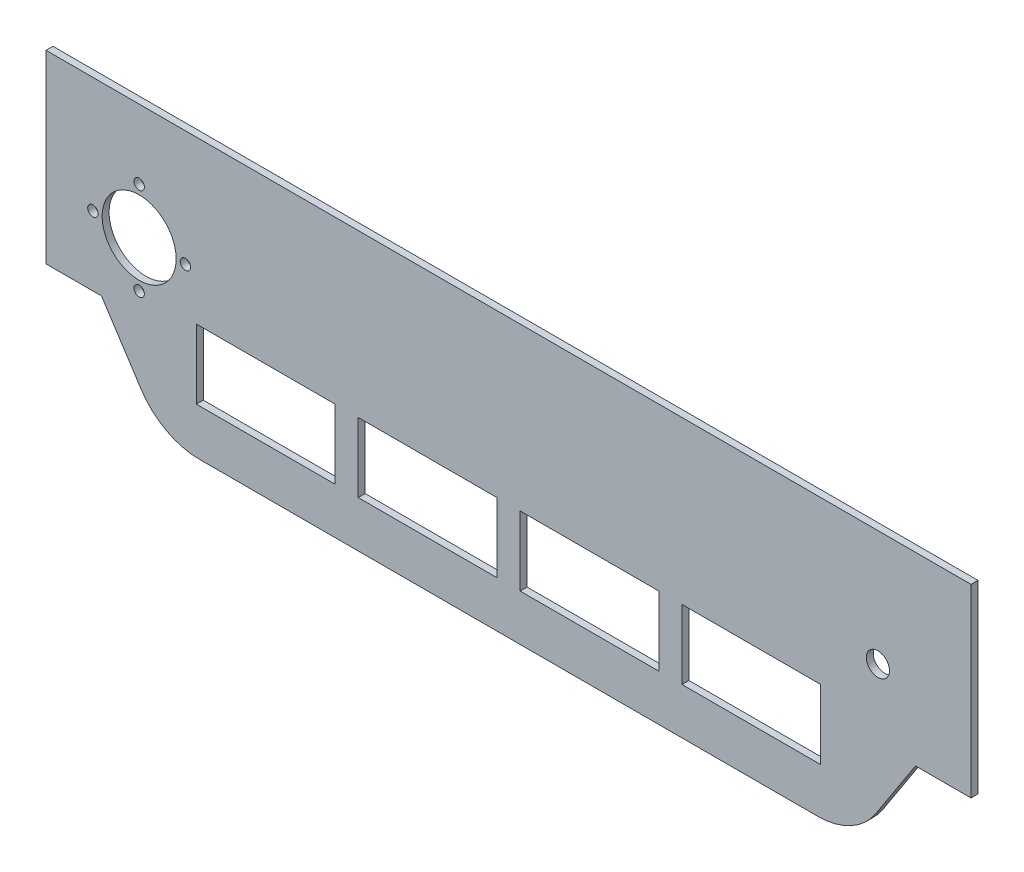
ISO-10303-21;
HEADER;
FILE_DESCRIPTION(('STEP AP214'),'2;1');
FILE_NAME('part.step','',(''),(''),'','','');
FILE_SCHEMA(('AUTOMOTIVE_DESIGN { 1 0 10303 214 1 1 1 1 }'));
ENDSEC;
DATA;
#1=APPLICATION_CONTEXT('core data for automotive mechanical design processes');
#2=APPLICATION_PROTOCOL_DEFINITION('international standard','automotive_design',2000,#1);
#3=PRODUCT_CONTEXT('',#1,'mechanical');
#4=PRODUCT('Part','Part','',(#3));
#5=PRODUCT_RELATED_PRODUCT_CATEGORY('part','',(#4));
#6=PRODUCT_DEFINITION_FORMATION('','',#4);
#7=PRODUCT_DEFINITION_CONTEXT('part definition',#1,'design');
#8=PRODUCT_DEFINITION('design','',#6,#7);
#9=PRODUCT_DEFINITION_SHAPE('','',#8);
#10=(LENGTH_UNIT() NAMED_UNIT(*) SI_UNIT(.MILLI.,.METRE.));
#11=(NAMED_UNIT(*) PLANE_ANGLE_UNIT() SI_UNIT($,.RADIAN.));
#12=(NAMED_UNIT(*) SI_UNIT($,.STERADIAN.) SOLID_ANGLE_UNIT());
#13=UNCERTAINTY_MEASURE_WITH_UNIT(LENGTH_MEASURE(1.E-05),#10,'distance_accuracy_value','');
#14=(GEOMETRIC_REPRESENTATION_CONTEXT(3) GLOBAL_UNCERTAINTY_ASSIGNED_CONTEXT((#13)) GLOBAL_UNIT_ASSIGNED_CONTEXT((#10,
#11,#12)) REPRESENTATION_CONTEXT('',''));
#15=CARTESIAN_POINT('',(0.,0.,0.));
#16=DIRECTION('',(0.,0.,1.));
#17=DIRECTION('',(1.,0.,0.));
#18=AXIS2_PLACEMENT_3D('',#15,#16,#17);
#19=CARTESIAN_POINT('',(399.872727163389,53.6503494821376,3.));
#20=DIRECTION('',(-0.838443616300637,0.544988350595414,0.));
#21=DIRECTION('',(-0.544988350595414,-0.838443616300637,0.));
#22=AXIS2_PLACEMENT_3D('',#19,#20,#21);
#23=PLANE('',#22);
#24=DIRECTION('',(0.,0.,1.));
#25=VECTOR('',#24,1.);
#26=CARTESIAN_POINT('',(391.,40.,0.));
#27=LINE('',#26,#25);
#28=CARTESIAN_POINT('',(391.,40.,0.));
#29=VERTEX_POINT('',#28);
#30=CARTESIAN_POINT('',(391.,40.,3.));
#31=VERTEX_POINT('',#30);
#32=EDGE_CURVE('E46',#29,#31,#27,.T.);
#33=ORIENTED_EDGE('',*,*,#32,.T.);
#34=DIRECTION('',(0.544988350595414,0.838443616300637,0.));
#35=VECTOR('',#34,1.);
#36=CARTESIAN_POINT('',(399.872727163389,53.6503494821376,3.));
#37=LINE('',#36,#35);
#38=CARTESIAN_POINT('',(373.872727163389,13.6503494821376,3.));
#39=VERTEX_POINT('',#38);
#40=EDGE_CURVE('E429',#39,#31,#37,.T.);
#41=ORIENTED_EDGE('',*,*,#40,.F.);
#42=DIRECTION('',(0.,0.,-1.));
#43=VECTOR('',#42,1.);
#44=CARTESIAN_POINT('',(373.872727163389,13.6503494821376,3.));
#45=LINE('',#44,#43);
#46=CARTESIAN_POINT('',(373.872727163389,13.6503494821376,0.));
#47=VERTEX_POINT('',#46);
#48=EDGE_CURVE('E431',#39,#47,#45,.T.);
#49=ORIENTED_EDGE('',*,*,#48,.T.);
#50=DIRECTION('',(0.544988350595414,0.838443616300637,0.));
#51=VECTOR('',#50,1.);
#52=CARTESIAN_POINT('',(399.872727163389,53.6503494821376,0.));
#53=LINE('',#52,#51);
#54=EDGE_CURVE('E423',#47,#29,#53,.T.);
#55=ORIENTED_EDGE('',*,*,#54,.T.);
#56=EDGE_LOOP('',(#33,#41,#49,#55));
#57=FACE_BOUND('',#56,.T.);
#58=ADVANCED_FACE('F31',(#57),#23,.F.);
#59=CARTESIAN_POINT('',(56.1272728366106,13.6503494821376,3.));
#60=DIRECTION('',(0.838443616300637,0.544988350595414,0.));
#61=DIRECTION('',(-0.544988350595414,0.838443616300637,0.));
#62=AXIS2_PLACEMENT_3D('',#59,#60,#61);
#63=PLANE('',#62);
#64=DIRECTION('',(0.544988350595414,-0.838443616300637,0.));
#65=VECTOR('',#64,1.);
#66=CARTESIAN_POINT('',(56.1272728366106,13.6503494821376,3.));
#67=LINE('',#66,#65);
#68=CARTESIAN_POINT('',(39.,40.,3.));
#69=VERTEX_POINT('',#68);
#70=CARTESIAN_POINT('',(56.1272728366106,13.6503494821376,3.));
#71=VERTEX_POINT('',#70);
#72=EDGE_CURVE('E54',#69,#71,#67,.T.);
#73=ORIENTED_EDGE('',*,*,#72,.F.);
#74=DIRECTION('',(0.,0.,1.));
#75=VECTOR('',#74,1.);
#76=CARTESIAN_POINT('',(38.9999999999999,40.0000000000001,0.));
#77=LINE('',#76,#75);
#78=CARTESIAN_POINT('',(38.9999999999999,40.0000000000001,0.));
#79=VERTEX_POINT('',#78);
#80=EDGE_CURVE('E249',#79,#69,#77,.T.);
#81=ORIENTED_EDGE('',*,*,#80,.F.);
#82=DIRECTION('',(0.544988350595414,-0.838443616300637,0.));
#83=VECTOR('',#82,1.);
#84=CARTESIAN_POINT('',(56.1272728366106,13.6503494821376,0.));
#85=LINE('',#84,#83);
#86=CARTESIAN_POINT('',(56.1272728366106,13.6503494821376,0.));
#87=VERTEX_POINT('',#86);
#88=EDGE_CURVE('E414',#79,#87,#85,.T.);
#89=ORIENTED_EDGE('',*,*,#88,.T.);
#90=DIRECTION('',(0.,0.,-1.));
#91=VECTOR('',#90,1.);
#92=CARTESIAN_POINT('',(56.1272728366106,13.6503494821376,3.));
#93=LINE('',#92,#91);
#94=EDGE_CURVE('E11',#71,#87,#93,.T.);
#95=ORIENTED_EDGE('',*,*,#94,.F.);
#96=EDGE_LOOP('',(#73,#81,#89,#95));
#97=FACE_BOUND('',#96,.T.);
#98=ADVANCED_FACE('F33',(#97),#63,.F.);
#99=CARTESIAN_POINT('',(81.2805813256297,30.,3.));
#100=DIRECTION('',(0.,0.,-1.));
#101=DIRECTION('',(-1.,0.,0.));
#102=AXIS2_PLACEMENT_3D('',#99,#100,#101);
#103=CYLINDRICAL_SURFACE('',#102,30.);
#104=CARTESIAN_POINT('',(81.2805813256297,30.,0.));
#105=DIRECTION('',(0.,0.,1.));
#106=DIRECTION('',(-1.,0.,0.));
#107=AXIS2_PLACEMENT_3D('',#104,#105,#106);
#108=CIRCLE('',#107,30.);
#109=CARTESIAN_POINT('',(81.2805813256297,0.,0.));
#110=VERTEX_POINT('',#109);
#111=EDGE_CURVE('E433',#87,#110,#108,.T.);
#112=ORIENTED_EDGE('',*,*,#111,.T.);
#113=DIRECTION('',(0.,0.,-1.));
#114=VECTOR('',#113,1.);
#115=CARTESIAN_POINT('',(81.2805813256297,0.,3.));
#116=LINE('',#115,#114);
#117=CARTESIAN_POINT('',(81.2805813256297,0.,3.));
#118=VERTEX_POINT('',#117);
#119=EDGE_CURVE('E39',#118,#110,#116,.T.);
#120=ORIENTED_EDGE('',*,*,#119,.F.);
#121=CARTESIAN_POINT('',(81.2805813256297,30.,3.));
#122=DIRECTION('',(0.,0.,1.));
#123=DIRECTION('',(-1.,0.,0.));
#124=AXIS2_PLACEMENT_3D('',#121,#122,#123);
#125=CIRCLE('',#124,30.);
#126=EDGE_CURVE('E422',#71,#118,#125,.T.);
#127=ORIENTED_EDGE('',*,*,#126,.F.);
#128=ORIENTED_EDGE('',*,*,#94,.T.);
#129=EDGE_LOOP('',(#112,#120,#127,#128));
#130=FACE_BOUND('',#129,.T.);
#131=ADVANCED_FACE('F461',(#130),#103,.T.);
#132=CARTESIAN_POINT('',(348.71941867437,0.,3.));
#133=DIRECTION('',(0.,1.,0.));
#134=DIRECTION('',(0.,0.,1.));
#135=AXIS2_PLACEMENT_3D('',#132,#133,#134);
#136=PLANE('',#135);
#137=DIRECTION('',(1.,0.,0.));
#138=VECTOR('',#137,1.);
#139=CARTESIAN_POINT('',(348.71941867437,0.,0.));
#140=LINE('',#139,#138);
#141=CARTESIAN_POINT('',(348.71941867437,0.,0.));
#142=VERTEX_POINT('',#141);
#143=EDGE_CURVE('E435',#110,#142,#140,.T.);
#144=ORIENTED_EDGE('',*,*,#143,.T.);
#145=DIRECTION('',(0.,0.,-1.));
#146=VECTOR('',#145,1.);
#147=CARTESIAN_POINT('',(348.71941867437,0.,3.));
#148=LINE('',#147,#146);
#149=CARTESIAN_POINT('',(348.71941867437,0.,3.));
#150=VERTEX_POINT('',#149);
#151=EDGE_CURVE('E442',#150,#142,#148,.T.);
#152=ORIENTED_EDGE('',*,*,#151,.F.);
#153=DIRECTION('',(1.,0.,0.));
#154=VECTOR('',#153,1.);
#155=CARTESIAN_POINT('',(348.71941867437,0.,3.));
#156=LINE('',#155,#154);
#157=EDGE_CURVE('E425',#118,#150,#156,.T.);
#158=ORIENTED_EDGE('',*,*,#157,.F.);
#159=ORIENTED_EDGE('',*,*,#119,.T.);
#160=EDGE_LOOP('',(#144,#152,#158,#159));
#161=FACE_BOUND('',#160,.T.);
#162=ADVANCED_FACE('F449',(#161),#136,.F.);
#163=CARTESIAN_POINT('',(348.71941867437,30.,3.));
#164=DIRECTION('',(0.,0.,-1.));
#165=DIRECTION('',(-1.,0.,0.));
#166=AXIS2_PLACEMENT_3D('',#163,#164,#165);
#167=CYLINDRICAL_SURFACE('',#166,30.);
#168=CARTESIAN_POINT('',(348.71941867437,30.,0.));
#169=DIRECTION('',(0.,0.,1.));
#170=DIRECTION('',(-1.,0.,0.));
#171=AXIS2_PLACEMENT_3D('',#168,#169,#170);
#172=CIRCLE('',#171,30.);
#173=EDGE_CURVE('E437',#142,#47,#172,.T.);
#174=ORIENTED_EDGE('',*,*,#173,.T.);
#175=ORIENTED_EDGE('',*,*,#48,.F.);
#176=CARTESIAN_POINT('',(348.71941867437,30.,3.));
#177=DIRECTION('',(0.,0.,1.));
#178=DIRECTION('',(-1.,0.,0.));
#179=AXIS2_PLACEMENT_3D('',#176,#177,#178);
#180=CIRCLE('',#179,30.);
#181=EDGE_CURVE('E427',#150,#39,#180,.T.);
#182=ORIENTED_EDGE('',*,*,#181,.F.);
#183=ORIENTED_EDGE('',*,*,#151,.T.);
#184=EDGE_LOOP('',(#174,#175,#182,#183));
#185=FACE_BOUND('',#184,.T.);
#186=ADVANCED_FACE('F457',(#185),#167,.T.);
#187=CARTESIAN_POINT('',(55.2805813256297,70.,3.));
#188=DIRECTION('',(0.,0.,1.));
#189=DIRECTION('',(1.,0.,0.));
#190=AXIS2_PLACEMENT_3D('',#187,#188,#189);
#191=PLANE('',#190);
#192=CARTESIAN_POINT('',(374.71941867437,70.,3.));
#193=DIRECTION('',(0.,0.,1.));
#194=DIRECTION('',(1.,0.,0.));
#195=AXIS2_PLACEMENT_3D('',#192,#193,#194);
#196=CIRCLE('',#195,4.99999999999999);
#197=CARTESIAN_POINT('',(379.71941867437,70.,3.));
#198=VERTEX_POINT('',#197);
#199=EDGE_CURVE('E248',#198,#198,#196,.T.);
#200=ORIENTED_EDGE('',*,*,#199,.F.);
#201=EDGE_LOOP('',(#200));
#202=FACE_BOUND('',#201,.T.);
#203=CARTESIAN_POINT('',(35.2805813256297,70.,3.));
#204=DIRECTION('',(0.,0.,1.));
#205=DIRECTION('',(1.,0.,0.));
#206=AXIS2_PLACEMENT_3D('',#203,#204,#205);
#207=CIRCLE('',#206,2.25);
#208=CARTESIAN_POINT('',(37.5305813256297,70.,3.));
#209=VERTEX_POINT('',#208);
#210=EDGE_CURVE('E260',#209,#209,#207,.T.);
#211=ORIENTED_EDGE('',*,*,#210,.F.);
#212=EDGE_LOOP('',(#211));
#213=FACE_BOUND('',#212,.T.);
#214=CARTESIAN_POINT('',(55.2805813256297,50.,3.));
#215=DIRECTION('',(0.,0.,1.));
#216=DIRECTION('',(1.,0.,0.));
#217=AXIS2_PLACEMENT_3D('',#214,#215,#216);
#218=CIRCLE('',#217,2.25);
#219=CARTESIAN_POINT('',(57.5305813256297,50.,3.));
#220=VERTEX_POINT('',#219);
#221=EDGE_CURVE('E266',#220,#220,#218,.T.);
#222=ORIENTED_EDGE('',*,*,#221,.F.);
#223=EDGE_LOOP('',(#222));
#224=FACE_BOUND('',#223,.T.);
#225=CARTESIAN_POINT('',(75.2805813256297,70.,3.));
#226=DIRECTION('',(0.,0.,1.));
#227=DIRECTION('',(1.,0.,0.));
#228=AXIS2_PLACEMENT_3D('',#225,#226,#227);
#229=CIRCLE('',#228,2.25);
#230=CARTESIAN_POINT('',(77.5305813256297,70.,3.));
#231=VERTEX_POINT('',#230);
#232=EDGE_CURVE('E272',#231,#231,#229,.T.);
#233=ORIENTED_EDGE('',*,*,#232,.F.);
#234=EDGE_LOOP('',(#233));
#235=FACE_BOUND('',#234,.T.);
#236=CARTESIAN_POINT('',(55.2805813256297,90.,3.));
#237=DIRECTION('',(0.,0.,1.));
#238=DIRECTION('',(1.,0.,0.));
#239=AXIS2_PLACEMENT_3D('',#236,#237,#238);
#240=CIRCLE('',#239,2.25);
#241=CARTESIAN_POINT('',(57.5305813256297,90.,3.));
#242=VERTEX_POINT('',#241);
#243=EDGE_CURVE('E278',#242,#242,#240,.T.);
#244=ORIENTED_EDGE('',*,*,#243,.F.);
#245=EDGE_LOOP('',(#244));
#246=FACE_BOUND('',#245,.T.);
#247=CARTESIAN_POINT('',(55.2805813256297,70.,3.));
#248=DIRECTION('',(0.,0.,1.));
#249=DIRECTION('',(1.,0.,0.));
#250=AXIS2_PLACEMENT_3D('',#247,#248,#249);
#251=CIRCLE('',#250,16.);
#252=CARTESIAN_POINT('',(71.2805813256297,70.,3.));
#253=VERTEX_POINT('',#252);
#254=EDGE_CURVE('E284',#253,#253,#251,.T.);
#255=ORIENTED_EDGE('',*,*,#254,.F.);
#256=EDGE_LOOP('',(#255));
#257=FACE_BOUND('',#256,.T.);
#258=DIRECTION('',(0.,-1.,0.));
#259=VECTOR('',#258,1.);
#260=CARTESIAN_POINT('',(290.,20.,3.));
#261=LINE('',#260,#259);
#262=CARTESIAN_POINT('',(290.,50.,3.));
#263=VERTEX_POINT('',#262);
#264=CARTESIAN_POINT('',(290.,20.,3.));
#265=VERTEX_POINT('',#264);
#266=EDGE_CURVE('E290',#263,#265,#261,.T.);
#267=ORIENTED_EDGE('',*,*,#266,.F.);
#268=DIRECTION('',(-1.,0.,0.));
#269=VECTOR('',#268,1.);
#270=CARTESIAN_POINT('',(350.,50.,3.));
#271=LINE('',#270,#269);
#272=CARTESIAN_POINT('',(350.,50.,3.));
#273=VERTEX_POINT('',#272);
#274=EDGE_CURVE('E297',#273,#263,#271,.T.);
#275=ORIENTED_EDGE('',*,*,#274,.F.);
#276=DIRECTION('',(0.,1.,0.));
#277=VECTOR('',#276,1.);
#278=CARTESIAN_POINT('',(350.,20.,3.));
#279=LINE('',#278,#277);
#280=CARTESIAN_POINT('',(350.,20.,3.));
#281=VERTEX_POINT('',#280);
#282=EDGE_CURVE('E311',#281,#273,#279,.T.);
#283=ORIENTED_EDGE('',*,*,#282,.F.);
#284=DIRECTION('',(1.,0.,0.));
#285=VECTOR('',#284,1.);
#286=CARTESIAN_POINT('',(350.,20.,3.));
#287=LINE('',#286,#285);
#288=EDGE_CURVE('E308',#265,#281,#287,.T.);
#289=ORIENTED_EDGE('',*,*,#288,.F.);
#290=EDGE_LOOP('',(#267,#275,#283,#289));
#291=FACE_BOUND('',#290,.T.);
#292=DIRECTION('',(0.,1.,0.));
#293=VECTOR('',#292,1.);
#294=CARTESIAN_POINT('',(280.,50.,3.));
#295=LINE('',#294,#293);
#296=CARTESIAN_POINT('',(280.,20.,3.));
#297=VERTEX_POINT('',#296);
#298=CARTESIAN_POINT('',(280.,50.,3.));
#299=VERTEX_POINT('',#298);
#300=EDGE_CURVE('E318',#297,#299,#295,.T.);
#301=ORIENTED_EDGE('',*,*,#300,.F.);
#302=DIRECTION('',(1.,0.,0.));
#303=VECTOR('',#302,1.);
#304=CARTESIAN_POINT('',(220.,20.,3.));
#305=LINE('',#304,#303);
#306=CARTESIAN_POINT('',(220.,20.,3.));
#307=VERTEX_POINT('',#306);
#308=EDGE_CURVE('E329',#307,#297,#305,.T.);
#309=ORIENTED_EDGE('',*,*,#308,.F.);
#310=DIRECTION('',(0.,-1.,0.));
#311=VECTOR('',#310,1.);
#312=CARTESIAN_POINT('',(220.,50.,3.));
#313=LINE('',#312,#311);
#314=CARTESIAN_POINT('',(220.,50.,3.));
#315=VERTEX_POINT('',#314);
#316=EDGE_CURVE('E343',#315,#307,#313,.T.);
#317=ORIENTED_EDGE('',*,*,#316,.F.);
#318=DIRECTION('',(-1.,0.,0.));
#319=VECTOR('',#318,1.);
#320=CARTESIAN_POINT('',(220.,50.,3.));
#321=LINE('',#320,#319);
#322=EDGE_CURVE('E340',#299,#315,#321,.T.);
#323=ORIENTED_EDGE('',*,*,#322,.F.);
#324=EDGE_LOOP('',(#301,#309,#317,#323));
#325=FACE_BOUND('',#324,.T.);
#326=DIRECTION('',(0.,1.,0.));
#327=VECTOR('',#326,1.);
#328=CARTESIAN_POINT('',(210.,50.,3.));
#329=LINE('',#328,#327);
#330=CARTESIAN_POINT('',(210.,20.,3.));
#331=VERTEX_POINT('',#330);
#332=CARTESIAN_POINT('',(210.,50.,3.));
#333=VERTEX_POINT('',#332);
#334=EDGE_CURVE('E350',#331,#333,#329,.T.);
#335=ORIENTED_EDGE('',*,*,#334,.F.);
#336=DIRECTION('',(1.,0.,0.));
#337=VECTOR('',#336,1.);
#338=CARTESIAN_POINT('',(150.,20.,3.));
#339=LINE('',#338,#337);
#340=CARTESIAN_POINT('',(150.,20.,3.));
#341=VERTEX_POINT('',#340);
#342=EDGE_CURVE('E361',#341,#331,#339,.T.);
#343=ORIENTED_EDGE('',*,*,#342,.F.);
#344=DIRECTION('',(0.,-1.,0.));
#345=VECTOR('',#344,1.);
#346=CARTESIAN_POINT('',(150.,50.,3.));
#347=LINE('',#346,#345);
#348=CARTESIAN_POINT('',(150.,50.,3.));
#349=VERTEX_POINT('',#348);
#350=EDGE_CURVE('E375',#349,#341,#347,.T.);
#351=ORIENTED_EDGE('',*,*,#350,.F.);
#352=DIRECTION('',(-1.,0.,0.));
#353=VECTOR('',#352,1.);
#354=CARTESIAN_POINT('',(150.,50.,3.));
#355=LINE('',#354,#353);
#356=EDGE_CURVE('E372',#333,#349,#355,.T.);
#357=ORIENTED_EDGE('',*,*,#356,.F.);
#358=EDGE_LOOP('',(#335,#343,#351,#357));
#359=FACE_BOUND('',#358,.T.);
#360=DIRECTION('',(0.,1.,0.));
#361=VECTOR('',#360,1.);
#362=CARTESIAN_POINT('',(140.,50.,3.));
#363=LINE('',#362,#361);
#364=CARTESIAN_POINT('',(140.,20.,3.));
#365=VERTEX_POINT('',#364);
#366=CARTESIAN_POINT('',(140.,50.,3.));
#367=VERTEX_POINT('',#366);
#368=EDGE_CURVE('E382',#365,#367,#363,.T.);
#369=ORIENTED_EDGE('',*,*,#368,.F.);
#370=DIRECTION('',(1.,0.,0.));
#371=VECTOR('',#370,1.);
#372=CARTESIAN_POINT('',(80.,20.,3.));
#373=LINE('',#372,#371);
#374=CARTESIAN_POINT('',(80.,20.,3.));
#375=VERTEX_POINT('',#374);
#376=EDGE_CURVE('E393',#375,#365,#373,.T.);
#377=ORIENTED_EDGE('',*,*,#376,.F.);
#378=DIRECTION('',(0.,-1.,0.));
#379=VECTOR('',#378,1.);
#380=CARTESIAN_POINT('',(80.,50.,3.));
#381=LINE('',#380,#379);
#382=CARTESIAN_POINT('',(80.,50.,3.));
#383=VERTEX_POINT('',#382);
#384=EDGE_CURVE('E407',#383,#375,#381,.T.);
#385=ORIENTED_EDGE('',*,*,#384,.F.);
#386=DIRECTION('',(-1.,0.,0.));
#387=VECTOR('',#386,1.);
#388=CARTESIAN_POINT('',(80.,50.,3.));
#389=LINE('',#388,#387);
#390=EDGE_CURVE('E404',#367,#383,#389,.T.);
#391=ORIENTED_EDGE('',*,*,#390,.F.);
#392=EDGE_LOOP('',(#369,#377,#385,#391));
#393=FACE_BOUND('',#392,.T.);
#394=ORIENTED_EDGE('',*,*,#40,.T.);
#395=DIRECTION('',(-1.,0.,0.));
#396=VECTOR('',#395,1.);
#397=CARTESIAN_POINT('',(215.,39.9999999999999,3.));
#398=LINE('',#397,#396);
#399=CARTESIAN_POINT('',(415.,39.9999999999999,3.));
#400=VERTEX_POINT('',#399);
#401=EDGE_CURVE('E241',#400,#31,#398,.T.);
#402=ORIENTED_EDGE('',*,*,#401,.F.);
#403=DIRECTION('',(0.,-1.,0.));
#404=VECTOR('',#403,1.);
#405=CARTESIAN_POINT('',(415.,-264.967528681372,3.));
#406=LINE('',#405,#404);
#407=CARTESIAN_POINT('',(415.,120.,3.));
#408=VERTEX_POINT('',#407);
#409=EDGE_CURVE('E222',#408,#400,#406,.T.);
#410=ORIENTED_EDGE('',*,*,#409,.F.);
#411=DIRECTION('',(1.,0.,0.));
#412=VECTOR('',#411,1.);
#413=CARTESIAN_POINT('',(215.,120.,3.));
#414=LINE('',#413,#412);
#415=CARTESIAN_POINT('',(15.,120.,3.));
#416=VERTEX_POINT('',#415);
#417=EDGE_CURVE('E244',#416,#408,#414,.T.);
#418=ORIENTED_EDGE('',*,*,#417,.F.);
#419=DIRECTION('',(0.,1.,0.));
#420=VECTOR('',#419,1.);
#421=CARTESIAN_POINT('',(15.0000000000001,-264.967528681372,3.));
#422=LINE('',#421,#420);
#423=CARTESIAN_POINT('',(15.,39.9999999999999,3.));
#424=VERTEX_POINT('',#423);
#425=EDGE_CURVE('E233',#424,#416,#422,.T.);
#426=ORIENTED_EDGE('',*,*,#425,.F.);
#427=DIRECTION('',(1.,0.,0.));
#428=VECTOR('',#427,1.);
#429=CARTESIAN_POINT('',(215.,40.,3.));
#430=LINE('',#429,#428);
#431=EDGE_CURVE('E230',#424,#69,#430,.T.);
#432=ORIENTED_EDGE('',*,*,#431,.T.);
#433=ORIENTED_EDGE('',*,*,#72,.T.);
#434=ORIENTED_EDGE('',*,*,#126,.T.);
#435=ORIENTED_EDGE('',*,*,#157,.T.);
#436=ORIENTED_EDGE('',*,*,#181,.T.);
#437=EDGE_LOOP('',(#394,#402,#410,#418,#426,#432,#433,#434,#435,#436));
#438=FACE_BOUND('',#437,.T.);
#439=ADVANCED_FACE('F460',(#202,#213,#224,#235,#246,#257,#291,#325,#359,#393,#438),#191,.T.);
#440=CARTESIAN_POINT('',(55.2805813256297,70.,0.));
#441=DIRECTION('',(0.,0.,1.));
#442=DIRECTION('',(1.,0.,0.));
#443=AXIS2_PLACEMENT_3D('',#440,#441,#442);
#444=PLANE('',#443);
#445=CARTESIAN_POINT('',(374.71941867437,70.,0.));
#446=DIRECTION('',(0.,0.,1.));
#447=DIRECTION('',(1.,0.,0.));
#448=AXIS2_PLACEMENT_3D('',#445,#446,#447);
#449=CIRCLE('',#448,4.99999999999999);
#450=CARTESIAN_POINT('',(379.71941867437,70.,0.));
#451=VERTEX_POINT('',#450);
#452=EDGE_CURVE('E257',#451,#451,#449,.T.);
#453=ORIENTED_EDGE('',*,*,#452,.T.);
#454=EDGE_LOOP('',(#453));
#455=FACE_BOUND('',#454,.T.);
#456=CARTESIAN_POINT('',(35.2805813256297,70.,0.));
#457=DIRECTION('',(0.,0.,1.));
#458=DIRECTION('',(1.,0.,0.));
#459=AXIS2_PLACEMENT_3D('',#456,#457,#458);
#460=CIRCLE('',#459,2.25);
#461=CARTESIAN_POINT('',(37.5305813256297,70.,0.));
#462=VERTEX_POINT('',#461);
#463=EDGE_CURVE('E263',#462,#462,#460,.T.);
#464=ORIENTED_EDGE('',*,*,#463,.T.);
#465=EDGE_LOOP('',(#464));
#466=FACE_BOUND('',#465,.T.);
#467=CARTESIAN_POINT('',(55.2805813256297,50.,0.));
#468=DIRECTION('',(0.,0.,1.));
#469=DIRECTION('',(1.,0.,0.));
#470=AXIS2_PLACEMENT_3D('',#467,#468,#469);
#471=CIRCLE('',#470,2.25);
#472=CARTESIAN_POINT('',(57.5305813256297,50.,0.));
#473=VERTEX_POINT('',#472);
#474=EDGE_CURVE('E269',#473,#473,#471,.T.);
#475=ORIENTED_EDGE('',*,*,#474,.T.);
#476=EDGE_LOOP('',(#475));
#477=FACE_BOUND('',#476,.T.);
#478=CARTESIAN_POINT('',(75.2805813256297,70.,0.));
#479=DIRECTION('',(0.,0.,1.));
#480=DIRECTION('',(1.,0.,0.));
#481=AXIS2_PLACEMENT_3D('',#478,#479,#480);
#482=CIRCLE('',#481,2.25);
#483=CARTESIAN_POINT('',(77.5305813256297,70.,0.));
#484=VERTEX_POINT('',#483);
#485=EDGE_CURVE('E275',#484,#484,#482,.T.);
#486=ORIENTED_EDGE('',*,*,#485,.T.);
#487=EDGE_LOOP('',(#486));
#488=FACE_BOUND('',#487,.T.);
#489=CARTESIAN_POINT('',(55.2805813256297,90.,0.));
#490=DIRECTION('',(0.,0.,1.));
#491=DIRECTION('',(1.,0.,0.));
#492=AXIS2_PLACEMENT_3D('',#489,#490,#491);
#493=CIRCLE('',#492,2.25);
#494=CARTESIAN_POINT('',(57.5305813256297,90.,0.));
#495=VERTEX_POINT('',#494);
#496=EDGE_CURVE('E281',#495,#495,#493,.T.);
#497=ORIENTED_EDGE('',*,*,#496,.T.);
#498=EDGE_LOOP('',(#497));
#499=FACE_BOUND('',#498,.T.);
#500=CARTESIAN_POINT('',(55.2805813256297,70.,0.));
#501=DIRECTION('',(0.,0.,1.));
#502=DIRECTION('',(1.,0.,0.));
#503=AXIS2_PLACEMENT_3D('',#500,#501,#502);
#504=CIRCLE('',#503,16.);
#505=CARTESIAN_POINT('',(71.2805813256297,70.,0.));
#506=VERTEX_POINT('',#505);
#507=EDGE_CURVE('E287',#506,#506,#504,.T.);
#508=ORIENTED_EDGE('',*,*,#507,.T.);
#509=EDGE_LOOP('',(#508));
#510=FACE_BOUND('',#509,.T.);
#511=DIRECTION('',(-1.,0.,0.));
#512=VECTOR('',#511,1.);
#513=CARTESIAN_POINT('',(350.,50.,0.));
#514=LINE('',#513,#512);
#515=CARTESIAN_POINT('',(350.,50.,0.));
#516=VERTEX_POINT('',#515);
#517=CARTESIAN_POINT('',(290.,50.,0.));
#518=VERTEX_POINT('',#517);
#519=EDGE_CURVE('E303',#516,#518,#514,.T.);
#520=ORIENTED_EDGE('',*,*,#519,.T.);
#521=DIRECTION('',(0.,-1.,0.));
#522=VECTOR('',#521,1.);
#523=CARTESIAN_POINT('',(290.,20.,0.));
#524=LINE('',#523,#522);
#525=CARTESIAN_POINT('',(290.,20.,0.));
#526=VERTEX_POINT('',#525);
#527=EDGE_CURVE('E293',#518,#526,#524,.T.);
#528=ORIENTED_EDGE('',*,*,#527,.T.);
#529=DIRECTION('',(1.,0.,0.));
#530=VECTOR('',#529,1.);
#531=CARTESIAN_POINT('',(350.,20.,0.));
#532=LINE('',#531,#530);
#533=CARTESIAN_POINT('',(350.,20.,0.));
#534=VERTEX_POINT('',#533);
#535=EDGE_CURVE('E296',#526,#534,#532,.T.);
#536=ORIENTED_EDGE('',*,*,#535,.T.);
#537=DIRECTION('',(0.,1.,0.));
#538=VECTOR('',#537,1.);
#539=CARTESIAN_POINT('',(350.,20.,0.));
#540=LINE('',#539,#538);
#541=EDGE_CURVE('E300',#534,#516,#540,.T.);
#542=ORIENTED_EDGE('',*,*,#541,.T.);
#543=EDGE_LOOP('',(#520,#528,#536,#542));
#544=FACE_BOUND('',#543,.T.);
#545=DIRECTION('',(1.,0.,0.));
#546=VECTOR('',#545,1.);
#547=CARTESIAN_POINT('',(220.,20.,0.));
#548=LINE('',#547,#546);
#549=CARTESIAN_POINT('',(220.,20.,0.));
#550=VERTEX_POINT('',#549);
#551=CARTESIAN_POINT('',(280.,20.,0.));
#552=VERTEX_POINT('',#551);
#553=EDGE_CURVE('E335',#550,#552,#548,.T.);
#554=ORIENTED_EDGE('',*,*,#553,.T.);
#555=DIRECTION('',(0.,1.,0.));
#556=VECTOR('',#555,1.);
#557=CARTESIAN_POINT('',(280.,50.,0.));
#558=LINE('',#557,#556);
#559=CARTESIAN_POINT('',(280.,50.,0.));
#560=VERTEX_POINT('',#559);
#561=EDGE_CURVE('E325',#552,#560,#558,.T.);
#562=ORIENTED_EDGE('',*,*,#561,.T.);
#563=DIRECTION('',(-1.,0.,0.));
#564=VECTOR('',#563,1.);
#565=CARTESIAN_POINT('',(220.,50.,0.));
#566=LINE('',#565,#564);
#567=CARTESIAN_POINT('',(220.,50.,0.));
#568=VERTEX_POINT('',#567);
#569=EDGE_CURVE('E328',#560,#568,#566,.T.);
#570=ORIENTED_EDGE('',*,*,#569,.T.);
#571=DIRECTION('',(0.,-1.,0.));
#572=VECTOR('',#571,1.);
#573=CARTESIAN_POINT('',(220.,50.,0.));
#574=LINE('',#573,#572);
#575=EDGE_CURVE('E332',#568,#550,#574,.T.);
#576=ORIENTED_EDGE('',*,*,#575,.T.);
#577=EDGE_LOOP('',(#554,#562,#570,#576));
#578=FACE_BOUND('',#577,.T.);
#579=DIRECTION('',(1.,0.,0.));
#580=VECTOR('',#579,1.);
#581=CARTESIAN_POINT('',(150.,20.,0.));
#582=LINE('',#581,#580);
#583=CARTESIAN_POINT('',(150.,20.,0.));
#584=VERTEX_POINT('',#583);
#585=CARTESIAN_POINT('',(210.,20.,0.));
#586=VERTEX_POINT('',#585);
#587=EDGE_CURVE('E367',#584,#586,#582,.T.);
#588=ORIENTED_EDGE('',*,*,#587,.T.);
#589=DIRECTION('',(0.,1.,0.));
#590=VECTOR('',#589,1.);
#591=CARTESIAN_POINT('',(210.,50.,0.));
#592=LINE('',#591,#590);
#593=CARTESIAN_POINT('',(210.,50.,0.));
#594=VERTEX_POINT('',#593);
#595=EDGE_CURVE('E357',#586,#594,#592,.T.);
#596=ORIENTED_EDGE('',*,*,#595,.T.);
#597=DIRECTION('',(-1.,0.,0.));
#598=VECTOR('',#597,1.);
#599=CARTESIAN_POINT('',(150.,50.,0.));
#600=LINE('',#599,#598);
#601=CARTESIAN_POINT('',(150.,50.,0.));
#602=VERTEX_POINT('',#601);
#603=EDGE_CURVE('E360',#594,#602,#600,.T.);
#604=ORIENTED_EDGE('',*,*,#603,.T.);
#605=DIRECTION('',(0.,-1.,0.));
#606=VECTOR('',#605,1.);
#607=CARTESIAN_POINT('',(150.,50.,0.));
#608=LINE('',#607,#606);
#609=EDGE_CURVE('E364',#602,#584,#608,.T.);
#610=ORIENTED_EDGE('',*,*,#609,.T.);
#611=EDGE_LOOP('',(#588,#596,#604,#610));
#612=FACE_BOUND('',#611,.T.);
#613=DIRECTION('',(1.,0.,0.));
#614=VECTOR('',#613,1.);
#615=CARTESIAN_POINT('',(80.,20.,0.));
#616=LINE('',#615,#614);
#617=CARTESIAN_POINT('',(80.,20.,0.));
#618=VERTEX_POINT('',#617);
#619=CARTESIAN_POINT('',(140.,20.,0.));
#620=VERTEX_POINT('',#619);
#621=EDGE_CURVE('E399',#618,#620,#616,.T.);
#622=ORIENTED_EDGE('',*,*,#621,.T.);
#623=DIRECTION('',(0.,1.,0.));
#624=VECTOR('',#623,1.);
#625=CARTESIAN_POINT('',(140.,50.,0.));
#626=LINE('',#625,#624);
#627=CARTESIAN_POINT('',(140.,50.,0.));
#628=VERTEX_POINT('',#627);
#629=EDGE_CURVE('E389',#620,#628,#626,.T.);
#630=ORIENTED_EDGE('',*,*,#629,.T.);
#631=DIRECTION('',(-1.,0.,0.));
#632=VECTOR('',#631,1.);
#633=CARTESIAN_POINT('',(80.,50.,0.));
#634=LINE('',#633,#632);
#635=CARTESIAN_POINT('',(80.,50.,0.));
#636=VERTEX_POINT('',#635);
#637=EDGE_CURVE('E392',#628,#636,#634,.T.);
#638=ORIENTED_EDGE('',*,*,#637,.T.);
#639=DIRECTION('',(0.,-1.,0.));
#640=VECTOR('',#639,1.);
#641=CARTESIAN_POINT('',(80.,50.,0.));
#642=LINE('',#641,#640);
#643=EDGE_CURVE('E396',#636,#618,#642,.T.);
#644=ORIENTED_EDGE('',*,*,#643,.T.);
#645=EDGE_LOOP('',(#622,#630,#638,#644));
#646=FACE_BOUND('',#645,.T.);
#647=DIRECTION('',(-1.,0.,0.));
#648=VECTOR('',#647,1.);
#649=CARTESIAN_POINT('',(215.,39.9999999999999,0.));
#650=LINE('',#649,#648);
#651=CARTESIAN_POINT('',(415.,39.9999999999999,0.));
#652=VERTEX_POINT('',#651);
#653=EDGE_CURVE('E211',#652,#29,#650,.T.);
#654=ORIENTED_EDGE('',*,*,#653,.T.);
#655=ORIENTED_EDGE('',*,*,#54,.F.);
#656=ORIENTED_EDGE('',*,*,#173,.F.);
#657=ORIENTED_EDGE('',*,*,#143,.F.);
#658=ORIENTED_EDGE('',*,*,#111,.F.);
#659=ORIENTED_EDGE('',*,*,#88,.F.);
#660=DIRECTION('',(1.,0.,0.));
#661=VECTOR('',#660,1.);
#662=CARTESIAN_POINT('',(215.,40.,0.));
#663=LINE('',#662,#661);
#664=CARTESIAN_POINT('',(15.,39.9999999999999,0.));
#665=VERTEX_POINT('',#664);
#666=EDGE_CURVE('E227',#665,#79,#663,.T.);
#667=ORIENTED_EDGE('',*,*,#666,.F.);
#668=DIRECTION('',(0.,1.,0.));
#669=VECTOR('',#668,1.);
#670=CARTESIAN_POINT('',(15.0000000000001,-264.967528681372,0.));
#671=LINE('',#670,#669);
#672=CARTESIAN_POINT('',(15.,120.,0.));
#673=VERTEX_POINT('',#672);
#674=EDGE_CURVE('E237',#665,#673,#671,.T.);
#675=ORIENTED_EDGE('',*,*,#674,.T.);
#676=DIRECTION('',(1.,0.,0.));
#677=VECTOR('',#676,1.);
#678=CARTESIAN_POINT('',(215.,120.,0.));
#679=LINE('',#678,#677);
#680=CARTESIAN_POINT('',(415.,120.,0.));
#681=VERTEX_POINT('',#680);
#682=EDGE_CURVE('E213',#673,#681,#679,.T.);
#683=ORIENTED_EDGE('',*,*,#682,.T.);
#684=DIRECTION('',(0.,-1.,0.));
#685=VECTOR('',#684,1.);
#686=CARTESIAN_POINT('',(415.,-264.967528681372,0.));
#687=LINE('',#686,#685);
#688=EDGE_CURVE('E206',#681,#652,#687,.T.);
#689=ORIENTED_EDGE('',*,*,#688,.T.);
#690=EDGE_LOOP('',(#654,#655,#656,#657,#658,#659,#667,#675,#683,#689));
#691=FACE_BOUND('',#690,.T.);
#692=ADVANCED_FACE('F208',(#455,#466,#477,#488,#499,#510,#544,#578,#612,#646,#691),#444,.F.);
#693=CARTESIAN_POINT('',(140.,50.,0.));
#694=DIRECTION('',(1.,0.,0.));
#695=DIRECTION('',(0.,0.,-1.));
#696=AXIS2_PLACEMENT_3D('',#693,#694,#695);
#697=PLANE('',#696);
#698=ORIENTED_EDGE('',*,*,#368,.T.);
#699=DIRECTION('',(0.,0.,1.));
#700=VECTOR('',#699,1.);
#701=CARTESIAN_POINT('',(140.,50.,0.));
#702=LINE('',#701,#700);
#703=EDGE_CURVE('E402',#628,#367,#702,.T.);
#704=ORIENTED_EDGE('',*,*,#703,.F.);
#705=ORIENTED_EDGE('',*,*,#629,.F.);
#706=DIRECTION('',(0.,0.,1.));
#707=VECTOR('',#706,1.);
#708=CARTESIAN_POINT('',(140.,20.,0.));
#709=LINE('',#708,#707);
#710=EDGE_CURVE('E412',#620,#365,#709,.T.);
#711=ORIENTED_EDGE('',*,*,#710,.T.);
#712=EDGE_LOOP('',(#698,#704,#705,#711));
#713=FACE_BOUND('',#712,.T.);
#714=ADVANCED_FACE('F519',(#713),#697,.F.);
#715=CARTESIAN_POINT('',(80.,20.,0.));
#716=DIRECTION('',(0.,-1.,0.));
#717=DIRECTION('',(0.,0.,-1.));
#718=AXIS2_PLACEMENT_3D('',#715,#716,#717);
#719=PLANE('',#718);
#720=ORIENTED_EDGE('',*,*,#376,.T.);
#721=ORIENTED_EDGE('',*,*,#710,.F.);
#722=ORIENTED_EDGE('',*,*,#621,.F.);
#723=DIRECTION('',(0.,0.,1.));
#724=VECTOR('',#723,1.);
#725=CARTESIAN_POINT('',(80.,20.,0.));
#726=LINE('',#725,#724);
#727=EDGE_CURVE('E415',#618,#375,#726,.T.);
#728=ORIENTED_EDGE('',*,*,#727,.T.);
#729=EDGE_LOOP('',(#720,#721,#722,#728));
#730=FACE_BOUND('',#729,.T.);
#731=ADVANCED_FACE('F526',(#730),#719,.F.);
#732=CARTESIAN_POINT('',(80.,50.,0.));
#733=DIRECTION('',(-1.,0.,0.));
#734=DIRECTION('',(0.,0.,1.));
#735=AXIS2_PLACEMENT_3D('',#732,#733,#734);
#736=PLANE('',#735);
#737=ORIENTED_EDGE('',*,*,#384,.T.);
#738=ORIENTED_EDGE('',*,*,#727,.F.);
#739=ORIENTED_EDGE('',*,*,#643,.F.);
#740=DIRECTION('',(0.,0.,1.));
#741=VECTOR('',#740,1.);
#742=CARTESIAN_POINT('',(80.,50.,0.));
#743=LINE('',#742,#741);
#744=EDGE_CURVE('E417',#636,#383,#743,.T.);
#745=ORIENTED_EDGE('',*,*,#744,.T.);
#746=EDGE_LOOP('',(#737,#738,#739,#745));
#747=FACE_BOUND('',#746,.T.);
#748=ADVANCED_FACE('F534',(#747),#736,.F.);
#749=CARTESIAN_POINT('',(80.,50.,0.));
#750=DIRECTION('',(0.,1.,0.));
#751=DIRECTION('',(0.,0.,1.));
#752=AXIS2_PLACEMENT_3D('',#749,#750,#751);
#753=PLANE('',#752);
#754=ORIENTED_EDGE('',*,*,#390,.T.);
#755=ORIENTED_EDGE('',*,*,#744,.F.);
#756=ORIENTED_EDGE('',*,*,#637,.F.);
#757=ORIENTED_EDGE('',*,*,#703,.T.);
#758=EDGE_LOOP('',(#754,#755,#756,#757));
#759=FACE_BOUND('',#758,.T.);
#760=ADVANCED_FACE('F542',(#759),#753,.F.);
#761=CARTESIAN_POINT('',(210.,50.,0.));
#762=DIRECTION('',(1.,0.,0.));
#763=DIRECTION('',(0.,0.,-1.));
#764=AXIS2_PLACEMENT_3D('',#761,#762,#763);
#765=PLANE('',#764);
#766=ORIENTED_EDGE('',*,*,#334,.T.);
#767=DIRECTION('',(0.,0.,1.));
#768=VECTOR('',#767,1.);
#769=CARTESIAN_POINT('',(210.,50.,0.));
#770=LINE('',#769,#768);
#771=EDGE_CURVE('E370',#594,#333,#770,.T.);
#772=ORIENTED_EDGE('',*,*,#771,.F.);
#773=ORIENTED_EDGE('',*,*,#595,.F.);
#774=DIRECTION('',(0.,0.,1.));
#775=VECTOR('',#774,1.);
#776=CARTESIAN_POINT('',(210.,20.,0.));
#777=LINE('',#776,#775);
#778=EDGE_CURVE('E380',#586,#331,#777,.T.);
#779=ORIENTED_EDGE('',*,*,#778,.T.);
#780=EDGE_LOOP('',(#766,#772,#773,#779));
#781=FACE_BOUND('',#780,.T.);
#782=ADVANCED_FACE('F550',(#781),#765,.F.);
#783=CARTESIAN_POINT('',(150.,20.,0.));
#784=DIRECTION('',(0.,-1.,0.));
#785=DIRECTION('',(0.,0.,-1.));
#786=AXIS2_PLACEMENT_3D('',#783,#784,#785);
#787=PLANE('',#786);
#788=ORIENTED_EDGE('',*,*,#342,.T.);
#789=ORIENTED_EDGE('',*,*,#778,.F.);
#790=ORIENTED_EDGE('',*,*,#587,.F.);
#791=DIRECTION('',(0.,0.,1.));
#792=VECTOR('',#791,1.);
#793=CARTESIAN_POINT('',(150.,20.,0.));
#794=LINE('',#793,#792);
#795=EDGE_CURVE('E383',#584,#341,#794,.T.);
#796=ORIENTED_EDGE('',*,*,#795,.T.);
#797=EDGE_LOOP('',(#788,#789,#790,#796));
#798=FACE_BOUND('',#797,.T.);
#799=ADVANCED_FACE('F558',(#798),#787,.F.);
#800=CARTESIAN_POINT('',(150.,50.,0.));
#801=DIRECTION('',(-1.,0.,0.));
#802=DIRECTION('',(0.,0.,1.));
#803=AXIS2_PLACEMENT_3D('',#800,#801,#802);
#804=PLANE('',#803);
#805=ORIENTED_EDGE('',*,*,#350,.T.);
#806=ORIENTED_EDGE('',*,*,#795,.F.);
#807=ORIENTED_EDGE('',*,*,#609,.F.);
#808=DIRECTION('',(0.,0.,1.));
#809=VECTOR('',#808,1.);
#810=CARTESIAN_POINT('',(150.,50.,0.));
#811=LINE('',#810,#809);
#812=EDGE_CURVE('E385',#602,#349,#811,.T.);
#813=ORIENTED_EDGE('',*,*,#812,.T.);
#814=EDGE_LOOP('',(#805,#806,#807,#813));
#815=FACE_BOUND('',#814,.T.);
#816=ADVANCED_FACE('F566',(#815),#804,.F.);
#817=CARTESIAN_POINT('',(150.,50.,0.));
#818=DIRECTION('',(0.,1.,0.));
#819=DIRECTION('',(0.,0.,1.));
#820=AXIS2_PLACEMENT_3D('',#817,#818,#819);
#821=PLANE('',#820);
#822=ORIENTED_EDGE('',*,*,#356,.T.);
#823=ORIENTED_EDGE('',*,*,#812,.F.);
#824=ORIENTED_EDGE('',*,*,#603,.F.);
#825=ORIENTED_EDGE('',*,*,#771,.T.);
#826=EDGE_LOOP('',(#822,#823,#824,#825));
#827=FACE_BOUND('',#826,.T.);
#828=ADVANCED_FACE('F574',(#827),#821,.F.);
#829=CARTESIAN_POINT('',(280.,50.,0.));
#830=DIRECTION('',(1.,0.,0.));
#831=DIRECTION('',(0.,0.,-1.));
#832=AXIS2_PLACEMENT_3D('',#829,#830,#831);
#833=PLANE('',#832);
#834=ORIENTED_EDGE('',*,*,#300,.T.);
#835=DIRECTION('',(0.,0.,1.));
#836=VECTOR('',#835,1.);
#837=CARTESIAN_POINT('',(280.,50.,0.));
#838=LINE('',#837,#836);
#839=EDGE_CURVE('E338',#560,#299,#838,.T.);
#840=ORIENTED_EDGE('',*,*,#839,.F.);
#841=ORIENTED_EDGE('',*,*,#561,.F.);
#842=DIRECTION('',(0.,0.,1.));
#843=VECTOR('',#842,1.);
#844=CARTESIAN_POINT('',(280.,20.,0.));
#845=LINE('',#844,#843);
#846=EDGE_CURVE('E348',#552,#297,#845,.T.);
#847=ORIENTED_EDGE('',*,*,#846,.T.);
#848=EDGE_LOOP('',(#834,#840,#841,#847));
#849=FACE_BOUND('',#848,.T.);
#850=ADVANCED_FACE('F582',(#849),#833,.F.);
#851=CARTESIAN_POINT('',(220.,20.,0.));
#852=DIRECTION('',(0.,-1.,0.));
#853=DIRECTION('',(0.,0.,-1.));
#854=AXIS2_PLACEMENT_3D('',#851,#852,#853);
#855=PLANE('',#854);
#856=ORIENTED_EDGE('',*,*,#308,.T.);
#857=ORIENTED_EDGE('',*,*,#846,.F.);
#858=ORIENTED_EDGE('',*,*,#553,.F.);
#859=DIRECTION('',(0.,0.,1.));
#860=VECTOR('',#859,1.);
#861=CARTESIAN_POINT('',(220.,20.,0.));
#862=LINE('',#861,#860);
#863=EDGE_CURVE('E351',#550,#307,#862,.T.);
#864=ORIENTED_EDGE('',*,*,#863,.T.);
#865=EDGE_LOOP('',(#856,#857,#858,#864));
#866=FACE_BOUND('',#865,.T.);
#867=ADVANCED_FACE('F590',(#866),#855,.F.);
#868=CARTESIAN_POINT('',(220.,50.,0.));
#869=DIRECTION('',(-1.,0.,0.));
#870=DIRECTION('',(0.,0.,1.));
#871=AXIS2_PLACEMENT_3D('',#868,#869,#870);
#872=PLANE('',#871);
#873=ORIENTED_EDGE('',*,*,#316,.T.);
#874=ORIENTED_EDGE('',*,*,#863,.F.);
#875=ORIENTED_EDGE('',*,*,#575,.F.);
#876=DIRECTION('',(0.,0.,1.));
#877=VECTOR('',#876,1.);
#878=CARTESIAN_POINT('',(220.,50.,0.));
#879=LINE('',#878,#877);
#880=EDGE_CURVE('E353',#568,#315,#879,.T.);
#881=ORIENTED_EDGE('',*,*,#880,.T.);
#882=EDGE_LOOP('',(#873,#874,#875,#881));
#883=FACE_BOUND('',#882,.T.);
#884=ADVANCED_FACE('F598',(#883),#872,.F.);
#885=CARTESIAN_POINT('',(220.,50.,0.));
#886=DIRECTION('',(0.,1.,0.));
#887=DIRECTION('',(0.,0.,1.));
#888=AXIS2_PLACEMENT_3D('',#885,#886,#887);
#889=PLANE('',#888);
#890=ORIENTED_EDGE('',*,*,#322,.T.);
#891=ORIENTED_EDGE('',*,*,#880,.F.);
#892=ORIENTED_EDGE('',*,*,#569,.F.);
#893=ORIENTED_EDGE('',*,*,#839,.T.);
#894=EDGE_LOOP('',(#890,#891,#892,#893));
#895=FACE_BOUND('',#894,.T.);
#896=ADVANCED_FACE('F606',(#895),#889,.F.);
#897=CARTESIAN_POINT('',(290.,20.,0.));
#898=DIRECTION('',(-1.,0.,0.));
#899=DIRECTION('',(0.,0.,1.));
#900=AXIS2_PLACEMENT_3D('',#897,#898,#899);
#901=PLANE('',#900);
#902=ORIENTED_EDGE('',*,*,#266,.T.);
#903=DIRECTION('',(0.,0.,1.));
#904=VECTOR('',#903,1.);
#905=CARTESIAN_POINT('',(290.,20.,0.));
#906=LINE('',#905,#904);
#907=EDGE_CURVE('E306',#526,#265,#906,.T.);
#908=ORIENTED_EDGE('',*,*,#907,.F.);
#909=ORIENTED_EDGE('',*,*,#527,.F.);
#910=DIRECTION('',(0.,0.,1.));
#911=VECTOR('',#910,1.);
#912=CARTESIAN_POINT('',(290.,50.,0.));
#913=LINE('',#912,#911);
#914=EDGE_CURVE('E316',#518,#263,#913,.T.);
#915=ORIENTED_EDGE('',*,*,#914,.T.);
#916=EDGE_LOOP('',(#902,#908,#909,#915));
#917=FACE_BOUND('',#916,.T.);
#918=ADVANCED_FACE('F614',(#917),#901,.F.);
#919=CARTESIAN_POINT('',(350.,50.,0.));
#920=DIRECTION('',(0.,1.,0.));
#921=DIRECTION('',(0.,0.,1.));
#922=AXIS2_PLACEMENT_3D('',#919,#920,#921);
#923=PLANE('',#922);
#924=ORIENTED_EDGE('',*,*,#274,.T.);
#925=ORIENTED_EDGE('',*,*,#914,.F.);
#926=ORIENTED_EDGE('',*,*,#519,.F.);
#927=DIRECTION('',(0.,0.,1.));
#928=VECTOR('',#927,1.);
#929=CARTESIAN_POINT('',(350.,50.,0.));
#930=LINE('',#929,#928);
#931=EDGE_CURVE('E319',#516,#273,#930,.T.);
#932=ORIENTED_EDGE('',*,*,#931,.T.);
#933=EDGE_LOOP('',(#924,#925,#926,#932));
#934=FACE_BOUND('',#933,.T.);
#935=ADVANCED_FACE('F622',(#934),#923,.F.);
#936=CARTESIAN_POINT('',(350.,20.,0.));
#937=DIRECTION('',(1.,0.,0.));
#938=DIRECTION('',(0.,0.,-1.));
#939=AXIS2_PLACEMENT_3D('',#936,#937,#938);
#940=PLANE('',#939);
#941=ORIENTED_EDGE('',*,*,#282,.T.);
#942=ORIENTED_EDGE('',*,*,#931,.F.);
#943=ORIENTED_EDGE('',*,*,#541,.F.);
#944=DIRECTION('',(0.,0.,1.));
#945=VECTOR('',#944,1.);
#946=CARTESIAN_POINT('',(350.,20.,0.));
#947=LINE('',#946,#945);
#948=EDGE_CURVE('E321',#534,#281,#947,.T.);
#949=ORIENTED_EDGE('',*,*,#948,.T.);
#950=EDGE_LOOP('',(#941,#942,#943,#949));
#951=FACE_BOUND('',#950,.T.);
#952=ADVANCED_FACE('F630',(#951),#940,.F.);
#953=CARTESIAN_POINT('',(350.,20.,0.));
#954=DIRECTION('',(0.,-1.,0.));
#955=DIRECTION('',(0.,0.,-1.));
#956=AXIS2_PLACEMENT_3D('',#953,#954,#955);
#957=PLANE('',#956);
#958=ORIENTED_EDGE('',*,*,#288,.T.);
#959=ORIENTED_EDGE('',*,*,#948,.F.);
#960=ORIENTED_EDGE('',*,*,#535,.F.);
#961=ORIENTED_EDGE('',*,*,#907,.T.);
#962=EDGE_LOOP('',(#958,#959,#960,#961));
#963=FACE_BOUND('',#962,.T.);
#964=ADVANCED_FACE('F638',(#963),#957,.F.);
#965=CARTESIAN_POINT('',(55.2805813256297,70.,0.));
#966=DIRECTION('',(0.,0.,1.));
#967=DIRECTION('',(1.,0.,0.));
#968=AXIS2_PLACEMENT_3D('',#965,#966,#967);
#969=CYLINDRICAL_SURFACE('',#968,16.);
#970=ORIENTED_EDGE('',*,*,#507,.F.);
#971=EDGE_LOOP('',(#970));
#972=FACE_BOUND('',#971,.T.);
#973=ORIENTED_EDGE('',*,*,#254,.T.);
#974=EDGE_LOOP('',(#973));
#975=FACE_BOUND('',#974,.T.);
#976=ADVANCED_FACE('F646',(#972,#975),#969,.F.);
#977=CARTESIAN_POINT('',(55.2805813256297,90.,0.));
#978=DIRECTION('',(0.,0.,1.));
#979=DIRECTION('',(1.,0.,0.));
#980=AXIS2_PLACEMENT_3D('',#977,#978,#979);
#981=CYLINDRICAL_SURFACE('',#980,2.25);
#982=ORIENTED_EDGE('',*,*,#496,.F.);
#983=EDGE_LOOP('',(#982));
#984=FACE_BOUND('',#983,.T.);
#985=ORIENTED_EDGE('',*,*,#243,.T.);
#986=EDGE_LOOP('',(#985));
#987=FACE_BOUND('',#986,.T.);
#988=ADVANCED_FACE('F654',(#984,#987),#981,.F.);
#989=CARTESIAN_POINT('',(75.2805813256297,70.,0.));
#990=DIRECTION('',(0.,0.,1.));
#991=DIRECTION('',(1.,0.,0.));
#992=AXIS2_PLACEMENT_3D('',#989,#990,#991);
#993=CYLINDRICAL_SURFACE('',#992,2.25);
#994=ORIENTED_EDGE('',*,*,#485,.F.);
#995=EDGE_LOOP('',(#994));
#996=FACE_BOUND('',#995,.T.);
#997=ORIENTED_EDGE('',*,*,#232,.T.);
#998=EDGE_LOOP('',(#997));
#999=FACE_BOUND('',#998,.T.);
#1000=ADVANCED_FACE('F662',(#996,#999),#993,.F.);
#1001=CARTESIAN_POINT('',(55.2805813256297,50.,0.));
#1002=DIRECTION('',(0.,0.,1.));
#1003=DIRECTION('',(1.,0.,0.));
#1004=AXIS2_PLACEMENT_3D('',#1001,#1002,#1003);
#1005=CYLINDRICAL_SURFACE('',#1004,2.25);
#1006=ORIENTED_EDGE('',*,*,#474,.F.);
#1007=EDGE_LOOP('',(#1006));
#1008=FACE_BOUND('',#1007,.T.);
#1009=ORIENTED_EDGE('',*,*,#221,.T.);
#1010=EDGE_LOOP('',(#1009));
#1011=FACE_BOUND('',#1010,.T.);
#1012=ADVANCED_FACE('F670',(#1008,#1011),#1005,.F.);
#1013=CARTESIAN_POINT('',(35.2805813256297,70.,0.));
#1014=DIRECTION('',(0.,0.,1.));
#1015=DIRECTION('',(1.,0.,0.));
#1016=AXIS2_PLACEMENT_3D('',#1013,#1014,#1015);
#1017=CYLINDRICAL_SURFACE('',#1016,2.25);
#1018=ORIENTED_EDGE('',*,*,#463,.F.);
#1019=EDGE_LOOP('',(#1018));
#1020=FACE_BOUND('',#1019,.T.);
#1021=ORIENTED_EDGE('',*,*,#210,.T.);
#1022=EDGE_LOOP('',(#1021));
#1023=FACE_BOUND('',#1022,.T.);
#1024=ADVANCED_FACE('F678',(#1020,#1023),#1017,.F.);
#1025=CARTESIAN_POINT('',(374.71941867437,70.,0.));
#1026=DIRECTION('',(0.,0.,1.));
#1027=DIRECTION('',(1.,0.,0.));
#1028=AXIS2_PLACEMENT_3D('',#1025,#1026,#1027);
#1029=CYLINDRICAL_SURFACE('',#1028,4.99999999999999);
#1030=ORIENTED_EDGE('',*,*,#452,.F.);
#1031=EDGE_LOOP('',(#1030));
#1032=FACE_BOUND('',#1031,.T.);
#1033=ORIENTED_EDGE('',*,*,#199,.T.);
#1034=EDGE_LOOP('',(#1033));
#1035=FACE_BOUND('',#1034,.T.);
#1036=ADVANCED_FACE('F686',(#1032,#1035),#1029,.F.);
#1037=CARTESIAN_POINT('',(215.,39.9999999999999,0.));
#1038=DIRECTION('',(0.,1.,0.));
#1039=DIRECTION('',(-1.,0.,0.));
#1040=AXIS2_PLACEMENT_3D('',#1037,#1038,#1039);
#1041=PLANE('',#1040);
#1042=ORIENTED_EDGE('',*,*,#401,.T.);
#1043=ORIENTED_EDGE('',*,*,#32,.F.);
#1044=ORIENTED_EDGE('',*,*,#653,.F.);
#1045=DIRECTION('',(0.,0.,1.));
#1046=VECTOR('',#1045,1.);
#1047=CARTESIAN_POINT('',(415.,39.9999999999999,0.));
#1048=LINE('',#1047,#1046);
#1049=EDGE_CURVE('E219',#652,#400,#1048,.T.);
#1050=ORIENTED_EDGE('',*,*,#1049,.T.);
#1051=EDGE_LOOP('',(#1042,#1043,#1044,#1050));
#1052=FACE_BOUND('',#1051,.T.);
#1053=ADVANCED_FACE('F229',(#1052),#1041,.F.);
#1054=CARTESIAN_POINT('',(215.,40.,0.));
#1055=DIRECTION('',(0.,-1.,0.));
#1056=DIRECTION('',(0.,0.,-1.));
#1057=AXIS2_PLACEMENT_3D('',#1054,#1055,#1056);
#1058=PLANE('',#1057);
#1059=ORIENTED_EDGE('',*,*,#431,.F.);
#1060=DIRECTION('',(0.,0.,1.));
#1061=VECTOR('',#1060,1.);
#1062=CARTESIAN_POINT('',(15.,39.9999999999999,0.));
#1063=LINE('',#1062,#1061);
#1064=EDGE_CURVE('E251',#665,#424,#1063,.T.);
#1065=ORIENTED_EDGE('',*,*,#1064,.F.);
#1066=ORIENTED_EDGE('',*,*,#666,.T.);
#1067=ORIENTED_EDGE('',*,*,#80,.T.);
#1068=EDGE_LOOP('',(#1059,#1065,#1066,#1067));
#1069=FACE_BOUND('',#1068,.T.);
#1070=ADVANCED_FACE('F467',(#1069),#1058,.T.);
#1071=CARTESIAN_POINT('',(15.0000000000001,-264.967528681372,0.));
#1072=DIRECTION('',(1.,0.,0.));
#1073=DIRECTION('',(0.,1.,0.));
#1074=AXIS2_PLACEMENT_3D('',#1071,#1072,#1073);
#1075=PLANE('',#1074);
#1076=ORIENTED_EDGE('',*,*,#425,.T.);
#1077=DIRECTION('',(0.,0.,1.));
#1078=VECTOR('',#1077,1.);
#1079=CARTESIAN_POINT('',(15.,120.,0.));
#1080=LINE('',#1079,#1078);
#1081=EDGE_CURVE('E253',#673,#416,#1080,.T.);
#1082=ORIENTED_EDGE('',*,*,#1081,.F.);
#1083=ORIENTED_EDGE('',*,*,#674,.F.);
#1084=ORIENTED_EDGE('',*,*,#1064,.T.);
#1085=EDGE_LOOP('',(#1076,#1082,#1083,#1084));
#1086=FACE_BOUND('',#1085,.T.);
#1087=ADVANCED_FACE('F470',(#1086),#1075,.F.);
#1088=CARTESIAN_POINT('',(215.,120.,0.));
#1089=DIRECTION('',(0.,-1.,0.));
#1090=DIRECTION('',(0.,0.,-1.));
#1091=AXIS2_PLACEMENT_3D('',#1088,#1089,#1090);
#1092=PLANE('',#1091);
#1093=ORIENTED_EDGE('',*,*,#417,.T.);
#1094=DIRECTION('',(0.,0.,1.));
#1095=VECTOR('',#1094,1.);
#1096=CARTESIAN_POINT('',(415.,120.,0.));
#1097=LINE('',#1096,#1095);
#1098=EDGE_CURVE('E226',#681,#408,#1097,.T.);
#1099=ORIENTED_EDGE('',*,*,#1098,.F.);
#1100=ORIENTED_EDGE('',*,*,#682,.F.);
#1101=ORIENTED_EDGE('',*,*,#1081,.T.);
#1102=EDGE_LOOP('',(#1093,#1099,#1100,#1101));
#1103=FACE_BOUND('',#1102,.T.);
#1104=ADVANCED_FACE('F473',(#1103),#1092,.F.);
#1105=CARTESIAN_POINT('',(415.,-264.967528681372,0.));
#1106=DIRECTION('',(-1.,0.,0.));
#1107=DIRECTION('',(0.,0.,1.));
#1108=AXIS2_PLACEMENT_3D('',#1105,#1106,#1107);
#1109=PLANE('',#1108);
#1110=ORIENTED_EDGE('',*,*,#409,.T.);
#1111=ORIENTED_EDGE('',*,*,#1049,.F.);
#1112=ORIENTED_EDGE('',*,*,#688,.F.);
#1113=ORIENTED_EDGE('',*,*,#1098,.T.);
#1114=EDGE_LOOP('',(#1110,#1111,#1112,#1113));
#1115=FACE_BOUND('',#1114,.T.);
#1116=ADVANCED_FACE('F220',(#1115),#1109,.F.);
#1117=CLOSED_SHELL('',(#58,#98,#131,#162,#186,#439,#692,#714,#731,#748,#760,#782,#799,#816,#828,
#850,#867,#884,#896,#918,#935,#952,#964,#976,#988,#1000,#1012,#1024,#1036,#1053,#1070,#1087,
#1104,#1116));
#1118=MANIFOLD_SOLID_BREP('B2',#1117);
#1119=ADVANCED_BREP_SHAPE_REPRESENTATION('',(#18,#1118),#14);
#1120=SHAPE_DEFINITION_REPRESENTATION(#9,#1119);
ENDSEC;
END-ISO-10303-21;
